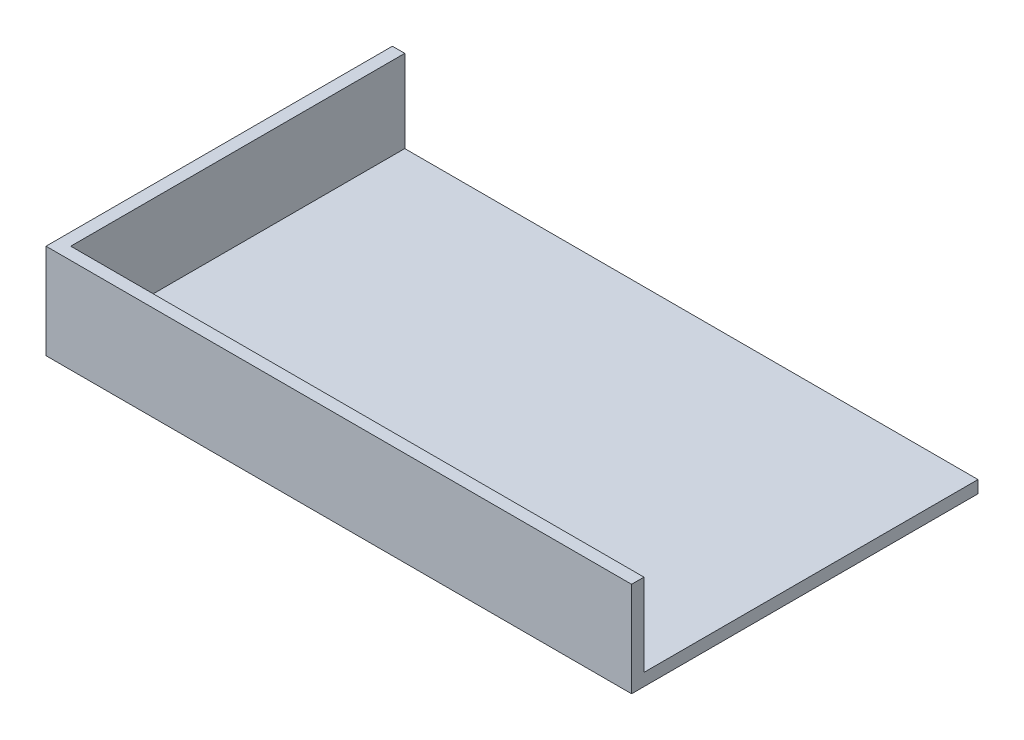
ISO-10303-21;
HEADER;
FILE_DESCRIPTION(('STEP AP214'),'2;1');
FILE_NAME('part.step','',(''),(''),'','','');
FILE_SCHEMA(('AUTOMOTIVE_DESIGN { 1 0 10303 214 1 1 1 1 }'));
ENDSEC;
DATA;
#1=APPLICATION_CONTEXT('core data for automotive mechanical design processes');
#2=APPLICATION_PROTOCOL_DEFINITION('international standard','automotive_design',2000,#1);
#3=PRODUCT_CONTEXT('',#1,'mechanical');
#4=PRODUCT('Part','Part','',(#3));
#5=PRODUCT_RELATED_PRODUCT_CATEGORY('part','',(#4));
#6=PRODUCT_DEFINITION_FORMATION('','',#4);
#7=PRODUCT_DEFINITION_CONTEXT('part definition',#1,'design');
#8=PRODUCT_DEFINITION('design','',#6,#7);
#9=PRODUCT_DEFINITION_SHAPE('','',#8);
#10=(LENGTH_UNIT() NAMED_UNIT(*) SI_UNIT(.MILLI.,.METRE.));
#11=(NAMED_UNIT(*) PLANE_ANGLE_UNIT() SI_UNIT($,.RADIAN.));
#12=(NAMED_UNIT(*) SI_UNIT($,.STERADIAN.) SOLID_ANGLE_UNIT());
#13=UNCERTAINTY_MEASURE_WITH_UNIT(LENGTH_MEASURE(1.E-05),#10,'distance_accuracy_value','');
#14=(GEOMETRIC_REPRESENTATION_CONTEXT(3) GLOBAL_UNCERTAINTY_ASSIGNED_CONTEXT((#13)) GLOBAL_UNIT_ASSIGNED_CONTEXT((#10,
#11,#12)) REPRESENTATION_CONTEXT('',''));
#15=CARTESIAN_POINT('',(0.,0.,0.));
#16=DIRECTION('',(0.,0.,1.));
#17=DIRECTION('',(1.,0.,0.));
#18=AXIS2_PLACEMENT_3D('',#15,#16,#17);
#19=CARTESIAN_POINT('',(0.,3.,0.));
#20=DIRECTION('',(0.,1.,0.));
#21=DIRECTION('',(0.,0.,1.));
#22=AXIS2_PLACEMENT_3D('',#19,#20,#21);
#23=PLANE('',#22);
#24=DIRECTION('',(-1.,0.,0.));
#25=VECTOR('',#24,1.);
#26=CARTESIAN_POINT('',(0.,3.,0.));
#27=LINE('',#26,#25);
#28=CARTESIAN_POINT('',(142.,3.,0.));
#29=VERTEX_POINT('',#28);
#30=CARTESIAN_POINT('',(3.,3.,0.));
#31=VERTEX_POINT('',#30);
#32=EDGE_CURVE('E96',#29,#31,#27,.T.);
#33=ORIENTED_EDGE('',*,*,#32,.T.);
#34=DIRECTION('',(0.,0.,-1.));
#35=VECTOR('',#34,1.);
#36=CARTESIAN_POINT('',(3.,3.,0.));
#37=LINE('',#36,#35);
#38=CARTESIAN_POINT('',(3.00000000000001,3.,81.));
#39=VERTEX_POINT('',#38);
#40=EDGE_CURVE('E180',#39,#31,#37,.T.);
#41=ORIENTED_EDGE('',*,*,#40,.F.);
#42=DIRECTION('',(-1.,0.,0.));
#43=VECTOR('',#42,1.);
#44=CARTESIAN_POINT('',(0.,3.,81.));
#45=LINE('',#44,#43);
#46=CARTESIAN_POINT('',(142.,3.,81.));
#47=VERTEX_POINT('',#46);
#48=EDGE_CURVE('E55',#47,#39,#45,.T.);
#49=ORIENTED_EDGE('',*,*,#48,.F.);
#50=DIRECTION('',(0.,0.,-1.));
#51=VECTOR('',#50,1.);
#52=CARTESIAN_POINT('',(142.,3.,0.));
#53=LINE('',#52,#51);
#54=EDGE_CURVE('E60',#47,#29,#53,.T.);
#55=ORIENTED_EDGE('',*,*,#54,.T.);
#56=EDGE_LOOP('',(#33,#41,#49,#55));
#57=FACE_BOUND('',#56,.T.);
#58=ADVANCED_FACE('F39',(#57),#23,.T.);
#59=CARTESIAN_POINT('',(0.,23.,81.));
#60=DIRECTION('',(0.,0.,1.));
#61=DIRECTION('',(1.,0.,0.));
#62=AXIS2_PLACEMENT_3D('',#59,#60,#61);
#63=PLANE('',#62);
#64=DIRECTION('',(0.,-1.,0.));
#65=VECTOR('',#64,1.);
#66=CARTESIAN_POINT('',(3.00000000000001,23.,81.));
#67=LINE('',#66,#65);
#68=CARTESIAN_POINT('',(3.00000000000001,23.,81.));
#69=VERTEX_POINT('',#68);
#70=EDGE_CURVE('E163',#69,#39,#67,.T.);
#71=ORIENTED_EDGE('',*,*,#70,.F.);
#72=DIRECTION('',(-1.,0.,0.));
#73=VECTOR('',#72,1.);
#74=CARTESIAN_POINT('',(0.,23.,81.));
#75=LINE('',#74,#73);
#76=CARTESIAN_POINT('',(142.,23.,81.));
#77=VERTEX_POINT('',#76);
#78=EDGE_CURVE('E155',#77,#69,#75,.T.);
#79=ORIENTED_EDGE('',*,*,#78,.F.);
#80=DIRECTION('',(0.,-1.,0.));
#81=VECTOR('',#80,1.);
#82=CARTESIAN_POINT('',(142.,23.,81.));
#83=LINE('',#82,#81);
#84=EDGE_CURVE('E118',#77,#47,#83,.T.);
#85=ORIENTED_EDGE('',*,*,#84,.T.);
#86=ORIENTED_EDGE('',*,*,#48,.T.);
#87=EDGE_LOOP('',(#71,#79,#85,#86));
#88=FACE_BOUND('',#87,.T.);
#89=ADVANCED_FACE('F162',(#88),#63,.F.);
#90=CARTESIAN_POINT('',(0.,3.,0.));
#91=DIRECTION('',(1.,0.,0.));
#92=DIRECTION('',(0.,0.,-1.));
#93=AXIS2_PLACEMENT_3D('',#90,#91,#92);
#94=PLANE('',#93);
#95=DIRECTION('',(0.,0.,1.));
#96=VECTOR('',#95,1.);
#97=CARTESIAN_POINT('',(0.,0.,0.));
#98=LINE('',#97,#96);
#99=CARTESIAN_POINT('',(0.,0.,0.));
#100=VERTEX_POINT('',#99);
#101=CARTESIAN_POINT('',(0.,0.,84.));
#102=VERTEX_POINT('',#101);
#103=EDGE_CURVE('E103',#100,#102,#98,.T.);
#104=ORIENTED_EDGE('',*,*,#103,.T.);
#105=DIRECTION('',(0.,-1.,0.));
#106=VECTOR('',#105,1.);
#107=CARTESIAN_POINT('',(0.,3.,84.));
#108=LINE('',#107,#106);
#109=CARTESIAN_POINT('',(0.,23.,84.));
#110=VERTEX_POINT('',#109);
#111=EDGE_CURVE('E11',#110,#102,#108,.T.);
#112=ORIENTED_EDGE('',*,*,#111,.F.);
#113=DIRECTION('',(0.,0.,1.));
#114=VECTOR('',#113,1.);
#115=CARTESIAN_POINT('',(0.,23.,84.));
#116=LINE('',#115,#114);
#117=CARTESIAN_POINT('',(0.,23.,0.));
#118=VERTEX_POINT('',#117);
#119=EDGE_CURVE('E132',#118,#110,#116,.T.);
#120=ORIENTED_EDGE('',*,*,#119,.F.);
#121=DIRECTION('',(0.,-1.,0.));
#122=VECTOR('',#121,1.);
#123=CARTESIAN_POINT('',(0.,3.,0.));
#124=LINE('',#123,#122);
#125=EDGE_CURVE('E98',#118,#100,#124,.T.);
#126=ORIENTED_EDGE('',*,*,#125,.T.);
#127=EDGE_LOOP('',(#104,#112,#120,#126));
#128=FACE_BOUND('',#127,.T.);
#129=ADVANCED_FACE('F41',(#128),#94,.F.);
#130=CARTESIAN_POINT('',(0.,3.,84.));
#131=DIRECTION('',(0.,0.,-1.));
#132=DIRECTION('',(-1.,0.,0.));
#133=AXIS2_PLACEMENT_3D('',#130,#131,#132);
#134=PLANE('',#133);
#135=DIRECTION('',(1.,0.,0.));
#136=VECTOR('',#135,1.);
#137=CARTESIAN_POINT('',(0.,0.,84.));
#138=LINE('',#137,#136);
#139=CARTESIAN_POINT('',(142.,0.,84.));
#140=VERTEX_POINT('',#139);
#141=EDGE_CURVE('E89',#102,#140,#138,.T.);
#142=ORIENTED_EDGE('',*,*,#141,.T.);
#143=DIRECTION('',(0.,-1.,0.));
#144=VECTOR('',#143,1.);
#145=CARTESIAN_POINT('',(142.,3.,84.));
#146=LINE('',#145,#144);
#147=CARTESIAN_POINT('',(142.,23.,84.));
#148=VERTEX_POINT('',#147);
#149=EDGE_CURVE('E48',#148,#140,#146,.T.);
#150=ORIENTED_EDGE('',*,*,#149,.F.);
#151=DIRECTION('',(1.,0.,0.));
#152=VECTOR('',#151,1.);
#153=CARTESIAN_POINT('',(0.,23.,84.));
#154=LINE('',#153,#152);
#155=EDGE_CURVE('E127',#110,#148,#154,.T.);
#156=ORIENTED_EDGE('',*,*,#155,.F.);
#157=ORIENTED_EDGE('',*,*,#111,.T.);
#158=EDGE_LOOP('',(#142,#150,#156,#157));
#159=FACE_BOUND('',#158,.T.);
#160=ADVANCED_FACE('F121',(#159),#134,.F.);
#161=CARTESIAN_POINT('',(142.,3.,0.));
#162=DIRECTION('',(-1.,0.,0.));
#163=DIRECTION('',(0.,0.,1.));
#164=AXIS2_PLACEMENT_3D('',#161,#162,#163);
#165=PLANE('',#164);
#166=DIRECTION('',(0.,0.,-1.));
#167=VECTOR('',#166,1.);
#168=CARTESIAN_POINT('',(142.,0.,0.));
#169=LINE('',#168,#167);
#170=CARTESIAN_POINT('',(142.,0.,0.));
#171=VERTEX_POINT('',#170);
#172=EDGE_CURVE('E78',#140,#171,#169,.T.);
#173=ORIENTED_EDGE('',*,*,#172,.T.);
#174=DIRECTION('',(0.,-1.,0.));
#175=VECTOR('',#174,1.);
#176=CARTESIAN_POINT('',(142.,3.,0.));
#177=LINE('',#176,#175);
#178=EDGE_CURVE('E81',#29,#171,#177,.T.);
#179=ORIENTED_EDGE('',*,*,#178,.F.);
#180=ORIENTED_EDGE('',*,*,#54,.F.);
#181=ORIENTED_EDGE('',*,*,#84,.F.);
#182=DIRECTION('',(0.,0.,-1.));
#183=VECTOR('',#182,1.);
#184=CARTESIAN_POINT('',(142.,23.,84.));
#185=LINE('',#184,#183);
#186=EDGE_CURVE('E151',#148,#77,#185,.T.);
#187=ORIENTED_EDGE('',*,*,#186,.F.);
#188=ORIENTED_EDGE('',*,*,#149,.T.);
#189=EDGE_LOOP('',(#173,#179,#180,#181,#187,#188));
#190=FACE_BOUND('',#189,.T.);
#191=ADVANCED_FACE('F80',(#190),#165,.F.);
#192=CARTESIAN_POINT('',(0.,3.,0.));
#193=DIRECTION('',(0.,0.,1.));
#194=DIRECTION('',(1.,0.,0.));
#195=AXIS2_PLACEMENT_3D('',#192,#193,#194);
#196=PLANE('',#195);
#197=DIRECTION('',(-1.,0.,0.));
#198=VECTOR('',#197,1.);
#199=CARTESIAN_POINT('',(0.,0.,0.));
#200=LINE('',#199,#198);
#201=EDGE_CURVE('E88',#171,#100,#200,.T.);
#202=ORIENTED_EDGE('',*,*,#201,.T.);
#203=ORIENTED_EDGE('',*,*,#125,.F.);
#204=DIRECTION('',(-1.,0.,0.));
#205=VECTOR('',#204,1.);
#206=CARTESIAN_POINT('',(0.,23.,0.));
#207=LINE('',#206,#205);
#208=CARTESIAN_POINT('',(3.,23.,0.));
#209=VERTEX_POINT('',#208);
#210=EDGE_CURVE('E136',#209,#118,#207,.T.);
#211=ORIENTED_EDGE('',*,*,#210,.F.);
#212=DIRECTION('',(0.,-1.,0.));
#213=VECTOR('',#212,1.);
#214=CARTESIAN_POINT('',(3.,23.,0.));
#215=LINE('',#214,#213);
#216=EDGE_CURVE('E172',#209,#31,#215,.T.);
#217=ORIENTED_EDGE('',*,*,#216,.T.);
#218=ORIENTED_EDGE('',*,*,#32,.F.);
#219=ORIENTED_EDGE('',*,*,#178,.T.);
#220=EDGE_LOOP('',(#202,#203,#211,#217,#218,#219));
#221=FACE_BOUND('',#220,.T.);
#222=ADVANCED_FACE('F92',(#221),#196,.F.);
#223=CARTESIAN_POINT('',(0.,0.,0.));
#224=DIRECTION('',(0.,1.,0.));
#225=DIRECTION('',(0.,0.,1.));
#226=AXIS2_PLACEMENT_3D('',#223,#224,#225);
#227=PLANE('',#226);
#228=ORIENTED_EDGE('',*,*,#103,.F.);
#229=ORIENTED_EDGE('',*,*,#201,.F.);
#230=ORIENTED_EDGE('',*,*,#172,.F.);
#231=ORIENTED_EDGE('',*,*,#141,.F.);
#232=EDGE_LOOP('',(#228,#229,#230,#231));
#233=FACE_BOUND('',#232,.T.);
#234=ADVANCED_FACE('F101',(#233),#227,.F.);
#235=CARTESIAN_POINT('',(0.,23.,0.));
#236=DIRECTION('',(0.,-1.,0.));
#237=DIRECTION('',(0.,0.,-1.));
#238=AXIS2_PLACEMENT_3D('',#235,#236,#237);
#239=PLANE('',#238);
#240=ORIENTED_EDGE('',*,*,#119,.T.);
#241=ORIENTED_EDGE('',*,*,#155,.T.);
#242=ORIENTED_EDGE('',*,*,#186,.T.);
#243=ORIENTED_EDGE('',*,*,#78,.T.);
#244=DIRECTION('',(0.,0.,-1.));
#245=VECTOR('',#244,1.);
#246=CARTESIAN_POINT('',(3.,23.,0.));
#247=LINE('',#246,#245);
#248=EDGE_CURVE('E183',#69,#209,#247,.T.);
#249=ORIENTED_EDGE('',*,*,#248,.T.);
#250=ORIENTED_EDGE('',*,*,#210,.T.);
#251=EDGE_LOOP('',(#240,#241,#242,#243,#249,#250));
#252=FACE_BOUND('',#251,.T.);
#253=ADVANCED_FACE('F153',(#252),#239,.F.);
#254=CARTESIAN_POINT('',(3.,23.,0.));
#255=DIRECTION('',(-1.,0.,0.));
#256=DIRECTION('',(0.,0.,1.));
#257=AXIS2_PLACEMENT_3D('',#254,#255,#256);
#258=PLANE('',#257);
#259=ORIENTED_EDGE('',*,*,#40,.T.);
#260=ORIENTED_EDGE('',*,*,#216,.F.);
#261=ORIENTED_EDGE('',*,*,#248,.F.);
#262=ORIENTED_EDGE('',*,*,#70,.T.);
#263=EDGE_LOOP('',(#259,#260,#261,#262));
#264=FACE_BOUND('',#263,.T.);
#265=ADVANCED_FACE('F188',(#264),#258,.F.);
#266=CLOSED_SHELL('',(#58,#89,#129,#160,#191,#222,#234,#253,#265));
#267=MANIFOLD_SOLID_BREP('B2',#266);
#268=ADVANCED_BREP_SHAPE_REPRESENTATION('',(#18,#267),#14);
#269=SHAPE_DEFINITION_REPRESENTATION(#9,#268);
ENDSEC;
END-ISO-10303-21;
